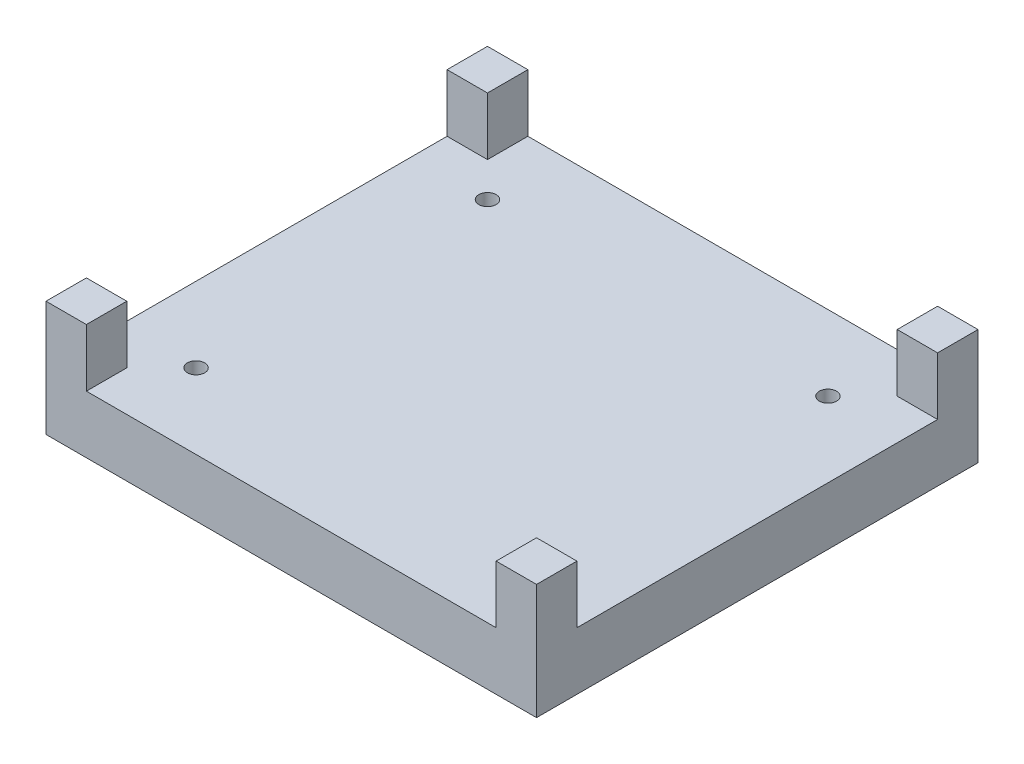
ISO-10303-21;
HEADER;
FILE_DESCRIPTION(('STEP AP214'),'2;1');
FILE_NAME('part.step','',(''),(''),'','','');
FILE_SCHEMA(('AUTOMOTIVE_DESIGN { 1 0 10303 214 1 1 1 1 }'));
ENDSEC;
DATA;
#1=APPLICATION_CONTEXT('core data for automotive mechanical design processes');
#2=APPLICATION_PROTOCOL_DEFINITION('international standard','automotive_design',2000,#1);
#3=PRODUCT_CONTEXT('',#1,'mechanical');
#4=PRODUCT('Part','Part','',(#3));
#5=PRODUCT_RELATED_PRODUCT_CATEGORY('part','',(#4));
#6=PRODUCT_DEFINITION_FORMATION('','',#4);
#7=PRODUCT_DEFINITION_CONTEXT('part definition',#1,'design');
#8=PRODUCT_DEFINITION('design','',#6,#7);
#9=PRODUCT_DEFINITION_SHAPE('','',#8);
#10=(LENGTH_UNIT() NAMED_UNIT(*) SI_UNIT(.MILLI.,.METRE.));
#11=(NAMED_UNIT(*) PLANE_ANGLE_UNIT() SI_UNIT($,.RADIAN.));
#12=(NAMED_UNIT(*) SI_UNIT($,.STERADIAN.) SOLID_ANGLE_UNIT());
#13=UNCERTAINTY_MEASURE_WITH_UNIT(LENGTH_MEASURE(1.E-05),#10,'distance_accuracy_value','');
#14=(GEOMETRIC_REPRESENTATION_CONTEXT(3) GLOBAL_UNCERTAINTY_ASSIGNED_CONTEXT((#13)) GLOBAL_UNIT_ASSIGNED_CONTEXT((#10,
#11,#12)) REPRESENTATION_CONTEXT('',''));
#15=CARTESIAN_POINT('',(0.,0.,0.));
#16=DIRECTION('',(0.,0.,1.));
#17=DIRECTION('',(1.,0.,0.));
#18=AXIS2_PLACEMENT_3D('',#15,#16,#17);
#19=CARTESIAN_POINT('',(0.,10.,0.));
#20=DIRECTION('',(0.,1.,0.));
#21=DIRECTION('',(0.,0.,1.));
#22=AXIS2_PLACEMENT_3D('',#19,#20,#21);
#23=PLANE('',#22);
#24=CARTESIAN_POINT('',(29.5,10.,-25.25));
#25=DIRECTION('',(0.,1.,0.));
#26=DIRECTION('',(0.,0.,1.));
#27=AXIS2_PLACEMENT_3D('',#24,#25,#26);
#28=CIRCLE('',#27,1.5);
#29=CARTESIAN_POINT('',(29.5,10.,-23.75));
#30=VERTEX_POINT('',#29);
#31=EDGE_CURVE('E282',#30,#30,#28,.T.);
#32=ORIENTED_EDGE('',*,*,#31,.F.);
#33=EDGE_LOOP('',(#32));
#34=FACE_BOUND('',#33,.T.);
#35=CARTESIAN_POINT('',(-29.5,10.,25.25));
#36=DIRECTION('',(0.,1.,0.));
#37=DIRECTION('',(0.,0.,1.));
#38=AXIS2_PLACEMENT_3D('',#35,#36,#37);
#39=CIRCLE('',#38,1.5);
#40=CARTESIAN_POINT('',(-29.5,10.,26.75));
#41=VERTEX_POINT('',#40);
#42=EDGE_CURVE('E286',#41,#41,#39,.T.);
#43=ORIENTED_EDGE('',*,*,#42,.F.);
#44=EDGE_LOOP('',(#43));
#45=FACE_BOUND('',#44,.T.);
#46=CARTESIAN_POINT('',(-29.5,10.,-25.25));
#47=DIRECTION('',(0.,1.,0.));
#48=DIRECTION('',(0.,0.,1.));
#49=AXIS2_PLACEMENT_3D('',#46,#47,#48);
#50=CIRCLE('',#49,1.5);
#51=CARTESIAN_POINT('',(-29.5,10.,-23.75));
#52=VERTEX_POINT('',#51);
#53=EDGE_CURVE('E302',#52,#52,#50,.T.);
#54=ORIENTED_EDGE('',*,*,#53,.F.);
#55=EDGE_LOOP('',(#54));
#56=FACE_BOUND('',#55,.T.);
#57=CARTESIAN_POINT('',(29.5,10.,25.25));
#58=DIRECTION('',(0.,1.,0.));
#59=DIRECTION('',(0.,0.,1.));
#60=AXIS2_PLACEMENT_3D('',#57,#58,#59);
#61=CIRCLE('',#60,1.5);
#62=CARTESIAN_POINT('',(29.5,10.,26.75));
#63=VERTEX_POINT('',#62);
#64=EDGE_CURVE('E306',#63,#63,#61,.T.);
#65=ORIENTED_EDGE('',*,*,#64,.F.);
#66=EDGE_LOOP('',(#65));
#67=FACE_BOUND('',#66,.T.);
#68=DIRECTION('',(0.,0.,1.));
#69=VECTOR('',#68,1.);
#70=CARTESIAN_POINT('',(35.5,10.,38.25));
#71=LINE('',#70,#69);
#72=CARTESIAN_POINT('',(35.5,10.,31.25));
#73=VERTEX_POINT('',#72);
#74=CARTESIAN_POINT('',(35.5,10.,38.25));
#75=VERTEX_POINT('',#74);
#76=EDGE_CURVE('E57',#73,#75,#71,.T.);
#77=ORIENTED_EDGE('',*,*,#76,.F.);
#78=DIRECTION('',(-1.,0.,0.));
#79=VECTOR('',#78,1.);
#80=CARTESIAN_POINT('',(42.5,10.,31.25));
#81=LINE('',#80,#79);
#82=CARTESIAN_POINT('',(42.5,10.,31.25));
#83=VERTEX_POINT('',#82);
#84=EDGE_CURVE('E549',#83,#73,#81,.T.);
#85=ORIENTED_EDGE('',*,*,#84,.F.);
#86=DIRECTION('',(0.,0.,-1.));
#87=VECTOR('',#86,1.);
#88=CARTESIAN_POINT('',(42.5,10.,0.));
#89=LINE('',#88,#87);
#90=CARTESIAN_POINT('',(42.5,10.,-31.25));
#91=VERTEX_POINT('',#90);
#92=EDGE_CURVE('E179',#83,#91,#89,.T.);
#93=ORIENTED_EDGE('',*,*,#92,.T.);
#94=DIRECTION('',(1.,0.,0.));
#95=VECTOR('',#94,1.);
#96=CARTESIAN_POINT('',(42.5,10.,-31.25));
#97=LINE('',#96,#95);
#98=CARTESIAN_POINT('',(35.5,10.,-31.25));
#99=VERTEX_POINT('',#98);
#100=EDGE_CURVE('E223',#99,#91,#97,.T.);
#101=ORIENTED_EDGE('',*,*,#100,.F.);
#102=DIRECTION('',(0.,0.,1.));
#103=VECTOR('',#102,1.);
#104=CARTESIAN_POINT('',(35.5,10.,-38.25));
#105=LINE('',#104,#103);
#106=CARTESIAN_POINT('',(35.5,10.,-38.25));
#107=VERTEX_POINT('',#106);
#108=EDGE_CURVE('E217',#107,#99,#105,.T.);
#109=ORIENTED_EDGE('',*,*,#108,.F.);
#110=DIRECTION('',(1.,0.,0.));
#111=VECTOR('',#110,1.);
#112=CARTESIAN_POINT('',(0.,10.,-38.25));
#113=LINE('',#112,#111);
#114=CARTESIAN_POINT('',(-35.5,10.,-38.25));
#115=VERTEX_POINT('',#114);
#116=EDGE_CURVE('E295',#115,#107,#113,.T.);
#117=ORIENTED_EDGE('',*,*,#116,.F.);
#118=DIRECTION('',(0.,0.,-1.));
#119=VECTOR('',#118,1.);
#120=CARTESIAN_POINT('',(-35.5,10.,-38.25));
#121=LINE('',#120,#119);
#122=CARTESIAN_POINT('',(-35.5,10.,-31.25));
#123=VERTEX_POINT('',#122);
#124=EDGE_CURVE('E253',#123,#115,#121,.T.);
#125=ORIENTED_EDGE('',*,*,#124,.F.);
#126=DIRECTION('',(1.,0.,0.));
#127=VECTOR('',#126,1.);
#128=CARTESIAN_POINT('',(-42.5,10.,-31.25));
#129=LINE('',#128,#127);
#130=CARTESIAN_POINT('',(-42.5,10.,-31.25));
#131=VERTEX_POINT('',#130);
#132=EDGE_CURVE('E247',#131,#123,#129,.T.);
#133=ORIENTED_EDGE('',*,*,#132,.F.);
#134=DIRECTION('',(0.,0.,-1.));
#135=VECTOR('',#134,1.);
#136=CARTESIAN_POINT('',(-42.5,10.,0.));
#137=LINE('',#136,#135);
#138=CARTESIAN_POINT('',(-42.5,10.,31.25));
#139=VERTEX_POINT('',#138);
#140=EDGE_CURVE('E299',#139,#131,#137,.T.);
#141=ORIENTED_EDGE('',*,*,#140,.F.);
#142=DIRECTION('',(-1.,0.,0.));
#143=VECTOR('',#142,1.);
#144=CARTESIAN_POINT('',(-42.5,10.,31.25));
#145=LINE('',#144,#143);
#146=CARTESIAN_POINT('',(-35.5,10.,31.25));
#147=VERTEX_POINT('',#146);
#148=EDGE_CURVE('E185',#147,#139,#145,.T.);
#149=ORIENTED_EDGE('',*,*,#148,.F.);
#150=DIRECTION('',(0.,0.,-1.));
#151=VECTOR('',#150,1.);
#152=CARTESIAN_POINT('',(-35.5,10.,38.25));
#153=LINE('',#152,#151);
#154=CARTESIAN_POINT('',(-35.5,10.,38.25));
#155=VERTEX_POINT('',#154);
#156=EDGE_CURVE('E181',#155,#147,#153,.T.);
#157=ORIENTED_EDGE('',*,*,#156,.F.);
#158=DIRECTION('',(1.,0.,0.));
#159=VECTOR('',#158,1.);
#160=CARTESIAN_POINT('',(0.,10.,38.25));
#161=LINE('',#160,#159);
#162=EDGE_CURVE('E62',#155,#75,#161,.T.);
#163=ORIENTED_EDGE('',*,*,#162,.T.);
#164=EDGE_LOOP('',(#77,#85,#93,#101,#109,#117,#125,#133,#141,#149,#157,#163));
#165=FACE_BOUND('',#164,.T.);
#166=ADVANCED_FACE('F41',(#34,#45,#56,#67,#165),#23,.T.);
#167=CARTESIAN_POINT('',(0.,10.,38.25));
#168=DIRECTION('',(0.,0.,-1.));
#169=DIRECTION('',(-1.,0.,0.));
#170=AXIS2_PLACEMENT_3D('',#167,#168,#169);
#171=PLANE('',#170);
#172=DIRECTION('',(1.,0.,0.));
#173=VECTOR('',#172,1.);
#174=CARTESIAN_POINT('',(0.,0.,38.25));
#175=LINE('',#174,#173);
#176=CARTESIAN_POINT('',(-42.5,0.,38.25));
#177=VERTEX_POINT('',#176);
#178=CARTESIAN_POINT('',(42.5,0.,38.25));
#179=VERTEX_POINT('',#178);
#180=EDGE_CURVE('E318',#177,#179,#175,.T.);
#181=ORIENTED_EDGE('',*,*,#180,.T.);
#182=DIRECTION('',(0.,-1.,0.));
#183=VECTOR('',#182,1.);
#184=CARTESIAN_POINT('',(42.5,10.,38.25));
#185=LINE('',#184,#183);
#186=CARTESIAN_POINT('',(42.5,20.,38.25));
#187=VERTEX_POINT('',#186);
#188=EDGE_CURVE('E11',#187,#179,#185,.T.);
#189=ORIENTED_EDGE('',*,*,#188,.F.);
#190=DIRECTION('',(1.,0.,0.));
#191=VECTOR('',#190,1.);
#192=CARTESIAN_POINT('',(42.5,20.,38.25));
#193=LINE('',#192,#191);
#194=CARTESIAN_POINT('',(35.5,20.,38.25));
#195=VERTEX_POINT('',#194);
#196=EDGE_CURVE('E172',#195,#187,#193,.T.);
#197=ORIENTED_EDGE('',*,*,#196,.F.);
#198=DIRECTION('',(0.,-1.,0.));
#199=VECTOR('',#198,1.);
#200=CARTESIAN_POINT('',(35.5,20.,38.25));
#201=LINE('',#200,#199);
#202=EDGE_CURVE('E187',#195,#75,#201,.T.);
#203=ORIENTED_EDGE('',*,*,#202,.T.);
#204=ORIENTED_EDGE('',*,*,#162,.F.);
#205=DIRECTION('',(0.,-1.,0.));
#206=VECTOR('',#205,1.);
#207=CARTESIAN_POINT('',(-35.5,20.,38.25));
#208=LINE('',#207,#206);
#209=CARTESIAN_POINT('',(-35.5,20.,38.25));
#210=VERTEX_POINT('',#209);
#211=EDGE_CURVE('E214',#210,#155,#208,.T.);
#212=ORIENTED_EDGE('',*,*,#211,.F.);
#213=DIRECTION('',(1.,0.,0.));
#214=VECTOR('',#213,1.);
#215=CARTESIAN_POINT('',(-42.5,20.,38.25));
#216=LINE('',#215,#214);
#217=CARTESIAN_POINT('',(-42.5,20.,38.25));
#218=VERTEX_POINT('',#217);
#219=EDGE_CURVE('E195',#218,#210,#216,.T.);
#220=ORIENTED_EDGE('',*,*,#219,.F.);
#221=DIRECTION('',(0.,-1.,0.));
#222=VECTOR('',#221,1.);
#223=CARTESIAN_POINT('',(-42.5,10.,38.25));
#224=LINE('',#223,#222);
#225=EDGE_CURVE('E310',#218,#177,#224,.T.);
#226=ORIENTED_EDGE('',*,*,#225,.T.);
#227=EDGE_LOOP('',(#181,#189,#197,#203,#204,#212,#220,#226));
#228=FACE_BOUND('',#227,.T.);
#229=ADVANCED_FACE('F393',(#228),#171,.F.);
#230=CARTESIAN_POINT('',(42.5,10.,0.));
#231=DIRECTION('',(-1.,0.,0.));
#232=DIRECTION('',(0.,0.,1.));
#233=AXIS2_PLACEMENT_3D('',#230,#231,#232);
#234=PLANE('',#233);
#235=DIRECTION('',(0.,0.,-1.));
#236=VECTOR('',#235,1.);
#237=CARTESIAN_POINT('',(42.5,0.,0.));
#238=LINE('',#237,#236);
#239=CARTESIAN_POINT('',(42.5,0.,-38.25));
#240=VERTEX_POINT('',#239);
#241=EDGE_CURVE('E322',#179,#240,#238,.T.);
#242=ORIENTED_EDGE('',*,*,#241,.T.);
#243=DIRECTION('',(0.,-1.,0.));
#244=VECTOR('',#243,1.);
#245=CARTESIAN_POINT('',(42.5,10.,-38.25));
#246=LINE('',#245,#244);
#247=CARTESIAN_POINT('',(42.5,20.,-38.25));
#248=VERTEX_POINT('',#247);
#249=EDGE_CURVE('E50',#248,#240,#246,.T.);
#250=ORIENTED_EDGE('',*,*,#249,.F.);
#251=DIRECTION('',(0.,0.,-1.));
#252=VECTOR('',#251,1.);
#253=CARTESIAN_POINT('',(42.5,20.,-38.25));
#254=LINE('',#253,#252);
#255=CARTESIAN_POINT('',(42.5,20.,-31.25));
#256=VERTEX_POINT('',#255);
#257=EDGE_CURVE('E218',#256,#248,#254,.T.);
#258=ORIENTED_EDGE('',*,*,#257,.F.);
#259=DIRECTION('',(0.,-1.,0.));
#260=VECTOR('',#259,1.);
#261=CARTESIAN_POINT('',(42.5,20.,-31.25));
#262=LINE('',#261,#260);
#263=EDGE_CURVE('E232',#256,#91,#262,.T.);
#264=ORIENTED_EDGE('',*,*,#263,.T.);
#265=ORIENTED_EDGE('',*,*,#92,.F.);
#266=DIRECTION('',(0.,-1.,0.));
#267=VECTOR('',#266,1.);
#268=CARTESIAN_POINT('',(42.5,20.,31.25));
#269=LINE('',#268,#267);
#270=CARTESIAN_POINT('',(42.5,20.,31.25));
#271=VERTEX_POINT('',#270);
#272=EDGE_CURVE('E159',#271,#83,#269,.T.);
#273=ORIENTED_EDGE('',*,*,#272,.F.);
#274=DIRECTION('',(0.,0.,-1.));
#275=VECTOR('',#274,1.);
#276=CARTESIAN_POINT('',(42.5,20.,38.25));
#277=LINE('',#276,#275);
#278=EDGE_CURVE('E166',#187,#271,#277,.T.);
#279=ORIENTED_EDGE('',*,*,#278,.F.);
#280=ORIENTED_EDGE('',*,*,#188,.T.);
#281=EDGE_LOOP('',(#242,#250,#258,#264,#265,#273,#279,#280));
#282=FACE_BOUND('',#281,.T.);
#283=ADVANCED_FACE('F177',(#282),#234,.F.);
#284=CARTESIAN_POINT('',(0.,10.,-38.25));
#285=DIRECTION('',(0.,0.,-1.));
#286=DIRECTION('',(-1.,0.,0.));
#287=AXIS2_PLACEMENT_3D('',#284,#285,#286);
#288=PLANE('',#287);
#289=DIRECTION('',(1.,0.,0.));
#290=VECTOR('',#289,1.);
#291=CARTESIAN_POINT('',(0.,0.,-38.25));
#292=LINE('',#291,#290);
#293=CARTESIAN_POINT('',(-42.5,0.,-38.25));
#294=VERTEX_POINT('',#293);
#295=EDGE_CURVE('E325',#294,#240,#292,.T.);
#296=ORIENTED_EDGE('',*,*,#295,.F.);
#297=DIRECTION('',(0.,-1.,0.));
#298=VECTOR('',#297,1.);
#299=CARTESIAN_POINT('',(-42.5,10.,-38.25));
#300=LINE('',#299,#298);
#301=CARTESIAN_POINT('',(-42.5,20.,-38.25));
#302=VERTEX_POINT('',#301);
#303=EDGE_CURVE('E342',#302,#294,#300,.T.);
#304=ORIENTED_EDGE('',*,*,#303,.F.);
#305=DIRECTION('',(-1.,0.,0.));
#306=VECTOR('',#305,1.);
#307=CARTESIAN_POINT('',(-42.5,20.,-38.25));
#308=LINE('',#307,#306);
#309=CARTESIAN_POINT('',(-35.5,20.,-38.25));
#310=VERTEX_POINT('',#309);
#311=EDGE_CURVE('E259',#310,#302,#308,.T.);
#312=ORIENTED_EDGE('',*,*,#311,.F.);
#313=DIRECTION('',(0.,-1.,0.));
#314=VECTOR('',#313,1.);
#315=CARTESIAN_POINT('',(-35.5,20.,-38.25));
#316=LINE('',#315,#314);
#317=EDGE_CURVE('E263',#310,#115,#316,.T.);
#318=ORIENTED_EDGE('',*,*,#317,.T.);
#319=ORIENTED_EDGE('',*,*,#116,.T.);
#320=DIRECTION('',(0.,-1.,0.));
#321=VECTOR('',#320,1.);
#322=CARTESIAN_POINT('',(35.5,20.,-38.25));
#323=LINE('',#322,#321);
#324=CARTESIAN_POINT('',(35.5,20.,-38.25));
#325=VERTEX_POINT('',#324);
#326=EDGE_CURVE('E244',#325,#107,#323,.T.);
#327=ORIENTED_EDGE('',*,*,#326,.F.);
#328=DIRECTION('',(-1.,0.,0.));
#329=VECTOR('',#328,1.);
#330=CARTESIAN_POINT('',(42.5,20.,-38.25));
#331=LINE('',#330,#329);
#332=EDGE_CURVE('E222',#248,#325,#331,.T.);
#333=ORIENTED_EDGE('',*,*,#332,.F.);
#334=ORIENTED_EDGE('',*,*,#249,.T.);
#335=EDGE_LOOP('',(#296,#304,#312,#318,#319,#327,#333,#334));
#336=FACE_BOUND('',#335,.T.);
#337=ADVANCED_FACE('F348',(#336),#288,.T.);
#338=CARTESIAN_POINT('',(-29.5,10.,-25.25));
#339=DIRECTION('',(0.,-1.,0.));
#340=DIRECTION('',(0.,0.,-1.));
#341=AXIS2_PLACEMENT_3D('',#338,#339,#340);
#342=CYLINDRICAL_SURFACE('',#341,1.5);
#343=ORIENTED_EDGE('',*,*,#53,.T.);
#344=EDGE_LOOP('',(#343));
#345=FACE_BOUND('',#344,.T.);
#346=CARTESIAN_POINT('',(-29.5,0.,-25.25));
#347=DIRECTION('',(0.,1.,0.));
#348=DIRECTION('',(0.,0.,1.));
#349=AXIS2_PLACEMENT_3D('',#346,#347,#348);
#350=CIRCLE('',#349,1.5);
#351=CARTESIAN_POINT('',(-29.5,0.,-23.75));
#352=VERTEX_POINT('',#351);
#353=EDGE_CURVE('E333',#352,#352,#350,.T.);
#354=ORIENTED_EDGE('',*,*,#353,.F.);
#355=EDGE_LOOP('',(#354));
#356=FACE_BOUND('',#355,.T.);
#357=ADVANCED_FACE('F414',(#345,#356),#342,.F.);
#358=CARTESIAN_POINT('',(-42.5,10.,0.));
#359=DIRECTION('',(-1.,0.,0.));
#360=DIRECTION('',(0.,0.,1.));
#361=AXIS2_PLACEMENT_3D('',#358,#359,#360);
#362=PLANE('',#361);
#363=DIRECTION('',(0.,0.,-1.));
#364=VECTOR('',#363,1.);
#365=CARTESIAN_POINT('',(-42.5,0.,0.));
#366=LINE('',#365,#364);
#367=EDGE_CURVE('E329',#177,#294,#366,.T.);
#368=ORIENTED_EDGE('',*,*,#367,.F.);
#369=ORIENTED_EDGE('',*,*,#225,.F.);
#370=DIRECTION('',(0.,0.,1.));
#371=VECTOR('',#370,1.);
#372=CARTESIAN_POINT('',(-42.5,20.,38.25));
#373=LINE('',#372,#371);
#374=CARTESIAN_POINT('',(-42.5,20.,31.25));
#375=VERTEX_POINT('',#374);
#376=EDGE_CURVE('E191',#375,#218,#373,.T.);
#377=ORIENTED_EDGE('',*,*,#376,.F.);
#378=DIRECTION('',(0.,-1.,0.));
#379=VECTOR('',#378,1.);
#380=CARTESIAN_POINT('',(-42.5,20.,31.25));
#381=LINE('',#380,#379);
#382=EDGE_CURVE('E203',#375,#139,#381,.T.);
#383=ORIENTED_EDGE('',*,*,#382,.T.);
#384=ORIENTED_EDGE('',*,*,#140,.T.);
#385=DIRECTION('',(0.,-1.,0.));
#386=VECTOR('',#385,1.);
#387=CARTESIAN_POINT('',(-42.5,20.,-31.25));
#388=LINE('',#387,#386);
#389=CARTESIAN_POINT('',(-42.5,20.,-31.25));
#390=VERTEX_POINT('',#389);
#391=EDGE_CURVE('E277',#390,#131,#388,.T.);
#392=ORIENTED_EDGE('',*,*,#391,.F.);
#393=DIRECTION('',(0.,0.,1.));
#394=VECTOR('',#393,1.);
#395=CARTESIAN_POINT('',(-42.5,20.,-38.25));
#396=LINE('',#395,#394);
#397=EDGE_CURVE('E248',#302,#390,#396,.T.);
#398=ORIENTED_EDGE('',*,*,#397,.F.);
#399=ORIENTED_EDGE('',*,*,#303,.T.);
#400=EDGE_LOOP('',(#368,#369,#377,#383,#384,#392,#398,#399));
#401=FACE_BOUND('',#400,.T.);
#402=ADVANCED_FACE('F357',(#401),#362,.T.);
#403=CARTESIAN_POINT('',(-29.5,10.,25.25));
#404=DIRECTION('',(0.,-1.,0.));
#405=DIRECTION('',(0.,0.,-1.));
#406=AXIS2_PLACEMENT_3D('',#403,#404,#405);
#407=CYLINDRICAL_SURFACE('',#406,1.5);
#408=ORIENTED_EDGE('',*,*,#42,.T.);
#409=EDGE_LOOP('',(#408));
#410=FACE_BOUND('',#409,.T.);
#411=CARTESIAN_POINT('',(-29.5,0.,25.25));
#412=DIRECTION('',(0.,1.,0.));
#413=DIRECTION('',(0.,0.,1.));
#414=AXIS2_PLACEMENT_3D('',#411,#412,#413);
#415=CIRCLE('',#414,1.5);
#416=CARTESIAN_POINT('',(-29.5,0.,26.75));
#417=VERTEX_POINT('',#416);
#418=EDGE_CURVE('E314',#417,#417,#415,.T.);
#419=ORIENTED_EDGE('',*,*,#418,.F.);
#420=EDGE_LOOP('',(#419));
#421=FACE_BOUND('',#420,.T.);
#422=ADVANCED_FACE('F420',(#410,#421),#407,.F.);
#423=CARTESIAN_POINT('',(29.5,10.,-25.25));
#424=DIRECTION('',(0.,-1.,0.));
#425=DIRECTION('',(0.,0.,-1.));
#426=AXIS2_PLACEMENT_3D('',#423,#424,#425);
#427=CYLINDRICAL_SURFACE('',#426,1.5);
#428=ORIENTED_EDGE('',*,*,#31,.T.);
#429=EDGE_LOOP('',(#428));
#430=FACE_BOUND('',#429,.T.);
#431=CARTESIAN_POINT('',(29.5,0.,-25.25));
#432=DIRECTION('',(0.,1.,0.));
#433=DIRECTION('',(0.,0.,1.));
#434=AXIS2_PLACEMENT_3D('',#431,#432,#433);
#435=CIRCLE('',#434,1.5);
#436=CARTESIAN_POINT('',(29.5,0.,-23.75));
#437=VERTEX_POINT('',#436);
#438=EDGE_CURVE('E281',#437,#437,#435,.T.);
#439=ORIENTED_EDGE('',*,*,#438,.F.);
#440=EDGE_LOOP('',(#439));
#441=FACE_BOUND('',#440,.T.);
#442=ADVANCED_FACE('F43',(#430,#441),#427,.F.);
#443=CARTESIAN_POINT('',(29.5,10.,25.25));
#444=DIRECTION('',(0.,-1.,0.));
#445=DIRECTION('',(0.,0.,-1.));
#446=AXIS2_PLACEMENT_3D('',#443,#444,#445);
#447=CYLINDRICAL_SURFACE('',#446,1.5);
#448=ORIENTED_EDGE('',*,*,#64,.T.);
#449=EDGE_LOOP('',(#448));
#450=FACE_BOUND('',#449,.T.);
#451=CARTESIAN_POINT('',(29.5,0.,25.25));
#452=DIRECTION('',(0.,1.,0.));
#453=DIRECTION('',(0.,0.,1.));
#454=AXIS2_PLACEMENT_3D('',#451,#452,#453);
#455=CIRCLE('',#454,1.5);
#456=CARTESIAN_POINT('',(29.5,0.,26.75));
#457=VERTEX_POINT('',#456);
#458=EDGE_CURVE('E287',#457,#457,#455,.T.);
#459=ORIENTED_EDGE('',*,*,#458,.F.);
#460=EDGE_LOOP('',(#459));
#461=FACE_BOUND('',#460,.T.);
#462=ADVANCED_FACE('F409',(#450,#461),#447,.F.);
#463=CARTESIAN_POINT('',(0.,0.,0.));
#464=DIRECTION('',(0.,1.,0.));
#465=DIRECTION('',(0.,0.,1.));
#466=AXIS2_PLACEMENT_3D('',#463,#464,#465);
#467=PLANE('',#466);
#468=ORIENTED_EDGE('',*,*,#438,.T.);
#469=EDGE_LOOP('',(#468));
#470=FACE_BOUND('',#469,.T.);
#471=ORIENTED_EDGE('',*,*,#418,.T.);
#472=EDGE_LOOP('',(#471));
#473=FACE_BOUND('',#472,.T.);
#474=ORIENTED_EDGE('',*,*,#180,.F.);
#475=ORIENTED_EDGE('',*,*,#367,.T.);
#476=ORIENTED_EDGE('',*,*,#295,.T.);
#477=ORIENTED_EDGE('',*,*,#241,.F.);
#478=EDGE_LOOP('',(#474,#475,#476,#477));
#479=FACE_BOUND('',#478,.T.);
#480=ORIENTED_EDGE('',*,*,#353,.T.);
#481=EDGE_LOOP('',(#480));
#482=FACE_BOUND('',#481,.T.);
#483=ORIENTED_EDGE('',*,*,#458,.T.);
#484=EDGE_LOOP('',(#483));
#485=FACE_BOUND('',#484,.T.);
#486=ADVANCED_FACE('F353',(#470,#473,#479,#482,#485),#467,.F.);
#487=CARTESIAN_POINT('',(-42.5,20.,-31.25));
#488=DIRECTION('',(0.,0.,-1.));
#489=DIRECTION('',(-1.,0.,0.));
#490=AXIS2_PLACEMENT_3D('',#487,#488,#489);
#491=PLANE('',#490);
#492=ORIENTED_EDGE('',*,*,#132,.T.);
#493=DIRECTION('',(0.,-1.,0.));
#494=VECTOR('',#493,1.);
#495=CARTESIAN_POINT('',(-35.5,20.,-31.25));
#496=LINE('',#495,#494);
#497=CARTESIAN_POINT('',(-35.5,20.,-31.25));
#498=VERTEX_POINT('',#497);
#499=EDGE_CURVE('E273',#498,#123,#496,.T.);
#500=ORIENTED_EDGE('',*,*,#499,.F.);
#501=DIRECTION('',(1.,0.,0.));
#502=VECTOR('',#501,1.);
#503=CARTESIAN_POINT('',(-42.5,20.,-31.25));
#504=LINE('',#503,#502);
#505=EDGE_CURVE('E252',#390,#498,#504,.T.);
#506=ORIENTED_EDGE('',*,*,#505,.F.);
#507=ORIENTED_EDGE('',*,*,#391,.T.);
#508=EDGE_LOOP('',(#492,#500,#506,#507));
#509=FACE_BOUND('',#508,.T.);
#510=ADVANCED_FACE('F405',(#509),#491,.F.);
#511=CARTESIAN_POINT('',(-35.5,20.,-38.25));
#512=DIRECTION('',(-1.,0.,0.));
#513=DIRECTION('',(0.,0.,1.));
#514=AXIS2_PLACEMENT_3D('',#511,#512,#513);
#515=PLANE('',#514);
#516=ORIENTED_EDGE('',*,*,#124,.T.);
#517=ORIENTED_EDGE('',*,*,#317,.F.);
#518=DIRECTION('',(0.,0.,-1.));
#519=VECTOR('',#518,1.);
#520=CARTESIAN_POINT('',(-35.5,20.,-38.25));
#521=LINE('',#520,#519);
#522=EDGE_CURVE('E256',#498,#310,#521,.T.);
#523=ORIENTED_EDGE('',*,*,#522,.F.);
#524=ORIENTED_EDGE('',*,*,#499,.T.);
#525=EDGE_LOOP('',(#516,#517,#523,#524));
#526=FACE_BOUND('',#525,.T.);
#527=ADVANCED_FACE('F369',(#526),#515,.F.);
#528=CARTESIAN_POINT('',(0.,20.,0.));
#529=DIRECTION('',(0.,1.,0.));
#530=DIRECTION('',(0.,0.,1.));
#531=AXIS2_PLACEMENT_3D('',#528,#529,#530);
#532=PLANE('',#531);
#533=ORIENTED_EDGE('',*,*,#397,.T.);
#534=ORIENTED_EDGE('',*,*,#505,.T.);
#535=ORIENTED_EDGE('',*,*,#522,.T.);
#536=ORIENTED_EDGE('',*,*,#311,.T.);
#537=EDGE_LOOP('',(#533,#534,#535,#536));
#538=FACE_BOUND('',#537,.T.);
#539=ADVANCED_FACE('F364',(#538),#532,.T.);
#540=CARTESIAN_POINT('',(35.5,20.,-38.25));
#541=DIRECTION('',(1.,0.,0.));
#542=DIRECTION('',(0.,0.,-1.));
#543=AXIS2_PLACEMENT_3D('',#540,#541,#542);
#544=PLANE('',#543);
#545=ORIENTED_EDGE('',*,*,#108,.T.);
#546=DIRECTION('',(0.,-1.,0.));
#547=VECTOR('',#546,1.);
#548=CARTESIAN_POINT('',(35.5,20.,-31.25));
#549=LINE('',#548,#547);
#550=CARTESIAN_POINT('',(35.5,20.,-31.25));
#551=VERTEX_POINT('',#550);
#552=EDGE_CURVE('E241',#551,#99,#549,.T.);
#553=ORIENTED_EDGE('',*,*,#552,.F.);
#554=DIRECTION('',(0.,0.,1.));
#555=VECTOR('',#554,1.);
#556=CARTESIAN_POINT('',(35.5,20.,-38.25));
#557=LINE('',#556,#555);
#558=EDGE_CURVE('E226',#325,#551,#557,.T.);
#559=ORIENTED_EDGE('',*,*,#558,.F.);
#560=ORIENTED_EDGE('',*,*,#326,.T.);
#561=EDGE_LOOP('',(#545,#553,#559,#560));
#562=FACE_BOUND('',#561,.T.);
#563=ADVANCED_FACE('F376',(#562),#544,.F.);
#564=CARTESIAN_POINT('',(42.5,20.,-31.25));
#565=DIRECTION('',(0.,0.,-1.));
#566=DIRECTION('',(-1.,0.,0.));
#567=AXIS2_PLACEMENT_3D('',#564,#565,#566);
#568=PLANE('',#567);
#569=ORIENTED_EDGE('',*,*,#100,.T.);
#570=ORIENTED_EDGE('',*,*,#263,.F.);
#571=DIRECTION('',(1.,0.,0.));
#572=VECTOR('',#571,1.);
#573=CARTESIAN_POINT('',(42.5,20.,-31.25));
#574=LINE('',#573,#572);
#575=EDGE_CURVE('E229',#551,#256,#574,.T.);
#576=ORIENTED_EDGE('',*,*,#575,.F.);
#577=ORIENTED_EDGE('',*,*,#552,.T.);
#578=EDGE_LOOP('',(#569,#570,#576,#577));
#579=FACE_BOUND('',#578,.T.);
#580=ADVANCED_FACE('F382',(#579),#568,.F.);
#581=CARTESIAN_POINT('',(0.,20.,0.));
#582=DIRECTION('',(0.,-1.,0.));
#583=DIRECTION('',(0.,0.,-1.));
#584=AXIS2_PLACEMENT_3D('',#581,#582,#583);
#585=PLANE('',#584);
#586=ORIENTED_EDGE('',*,*,#257,.T.);
#587=ORIENTED_EDGE('',*,*,#332,.T.);
#588=ORIENTED_EDGE('',*,*,#558,.T.);
#589=ORIENTED_EDGE('',*,*,#575,.T.);
#590=EDGE_LOOP('',(#586,#587,#588,#589));
#591=FACE_BOUND('',#590,.T.);
#592=ADVANCED_FACE('F379',(#591),#585,.F.);
#593=CARTESIAN_POINT('',(-35.5,20.,38.25));
#594=DIRECTION('',(-1.,0.,0.));
#595=DIRECTION('',(0.,0.,1.));
#596=AXIS2_PLACEMENT_3D('',#593,#594,#595);
#597=PLANE('',#596);
#598=ORIENTED_EDGE('',*,*,#156,.T.);
#599=DIRECTION('',(0.,-1.,0.));
#600=VECTOR('',#599,1.);
#601=CARTESIAN_POINT('',(-35.5,20.,31.25));
#602=LINE('',#601,#600);
#603=CARTESIAN_POINT('',(-35.5,20.,31.25));
#604=VERTEX_POINT('',#603);
#605=EDGE_CURVE('E210',#604,#147,#602,.T.);
#606=ORIENTED_EDGE('',*,*,#605,.F.);
#607=DIRECTION('',(0.,0.,-1.));
#608=VECTOR('',#607,1.);
#609=CARTESIAN_POINT('',(-35.5,20.,38.25));
#610=LINE('',#609,#608);
#611=EDGE_CURVE('E198',#210,#604,#610,.T.);
#612=ORIENTED_EDGE('',*,*,#611,.F.);
#613=ORIENTED_EDGE('',*,*,#211,.T.);
#614=EDGE_LOOP('',(#598,#606,#612,#613));
#615=FACE_BOUND('',#614,.T.);
#616=ADVANCED_FACE('F389',(#615),#597,.F.);
#617=CARTESIAN_POINT('',(-42.5,20.,31.25));
#618=DIRECTION('',(0.,0.,1.));
#619=DIRECTION('',(1.,0.,0.));
#620=AXIS2_PLACEMENT_3D('',#617,#618,#619);
#621=PLANE('',#620);
#622=ORIENTED_EDGE('',*,*,#148,.T.);
#623=ORIENTED_EDGE('',*,*,#382,.F.);
#624=DIRECTION('',(-1.,0.,0.));
#625=VECTOR('',#624,1.);
#626=CARTESIAN_POINT('',(-42.5,20.,31.25));
#627=LINE('',#626,#625);
#628=EDGE_CURVE('E201',#604,#375,#627,.T.);
#629=ORIENTED_EDGE('',*,*,#628,.F.);
#630=ORIENTED_EDGE('',*,*,#605,.T.);
#631=EDGE_LOOP('',(#622,#623,#629,#630));
#632=FACE_BOUND('',#631,.T.);
#633=ADVANCED_FACE('F496',(#632),#621,.F.);
#634=CARTESIAN_POINT('',(0.,20.,0.));
#635=DIRECTION('',(0.,-1.,0.));
#636=DIRECTION('',(0.,0.,-1.));
#637=AXIS2_PLACEMENT_3D('',#634,#635,#636);
#638=PLANE('',#637);
#639=ORIENTED_EDGE('',*,*,#376,.T.);
#640=ORIENTED_EDGE('',*,*,#219,.T.);
#641=ORIENTED_EDGE('',*,*,#611,.T.);
#642=ORIENTED_EDGE('',*,*,#628,.T.);
#643=EDGE_LOOP('',(#639,#640,#641,#642));
#644=FACE_BOUND('',#643,.T.);
#645=ADVANCED_FACE('F506',(#644),#638,.F.);
#646=CARTESIAN_POINT('',(42.5,20.,31.25));
#647=DIRECTION('',(0.,0.,1.));
#648=DIRECTION('',(1.,0.,0.));
#649=AXIS2_PLACEMENT_3D('',#646,#647,#648);
#650=PLANE('',#649);
#651=ORIENTED_EDGE('',*,*,#84,.T.);
#652=DIRECTION('',(0.,-1.,0.));
#653=VECTOR('',#652,1.);
#654=CARTESIAN_POINT('',(35.5,20.,31.25));
#655=LINE('',#654,#653);
#656=CARTESIAN_POINT('',(35.5,20.,31.25));
#657=VERTEX_POINT('',#656);
#658=EDGE_CURVE('E161',#657,#73,#655,.T.);
#659=ORIENTED_EDGE('',*,*,#658,.F.);
#660=DIRECTION('',(-1.,0.,0.));
#661=VECTOR('',#660,1.);
#662=CARTESIAN_POINT('',(42.5,20.,31.25));
#663=LINE('',#662,#661);
#664=EDGE_CURVE('E155',#271,#657,#663,.T.);
#665=ORIENTED_EDGE('',*,*,#664,.F.);
#666=ORIENTED_EDGE('',*,*,#272,.T.);
#667=EDGE_LOOP('',(#651,#659,#665,#666));
#668=FACE_BOUND('',#667,.T.);
#669=ADVANCED_FACE('F157',(#668),#650,.F.);
#670=CARTESIAN_POINT('',(35.5,20.,38.25));
#671=DIRECTION('',(1.,0.,0.));
#672=DIRECTION('',(0.,0.,-1.));
#673=AXIS2_PLACEMENT_3D('',#670,#671,#672);
#674=PLANE('',#673);
#675=ORIENTED_EDGE('',*,*,#76,.T.);
#676=ORIENTED_EDGE('',*,*,#202,.F.);
#677=DIRECTION('',(0.,0.,1.));
#678=VECTOR('',#677,1.);
#679=CARTESIAN_POINT('',(35.5,20.,38.25));
#680=LINE('',#679,#678);
#681=EDGE_CURVE('E165',#657,#195,#680,.T.);
#682=ORIENTED_EDGE('',*,*,#681,.F.);
#683=ORIENTED_EDGE('',*,*,#658,.T.);
#684=EDGE_LOOP('',(#675,#676,#682,#683));
#685=FACE_BOUND('',#684,.T.);
#686=ADVANCED_FACE('F525',(#685),#674,.F.);
#687=CARTESIAN_POINT('',(0.,20.,0.));
#688=DIRECTION('',(0.,1.,0.));
#689=DIRECTION('',(0.,0.,1.));
#690=AXIS2_PLACEMENT_3D('',#687,#688,#689);
#691=PLANE('',#690);
#692=ORIENTED_EDGE('',*,*,#278,.T.);
#693=ORIENTED_EDGE('',*,*,#664,.T.);
#694=ORIENTED_EDGE('',*,*,#681,.T.);
#695=ORIENTED_EDGE('',*,*,#196,.T.);
#696=EDGE_LOOP('',(#692,#693,#694,#695));
#697=FACE_BOUND('',#696,.T.);
#698=ADVANCED_FACE('F170',(#697),#691,.T.);
#699=CLOSED_SHELL('',(#166,#229,#283,#337,#357,#402,#422,#442,#462,#486,#510,#527,#539,#563,
#580,#592,#616,#633,#645,#669,#686,#698));
#700=MANIFOLD_SOLID_BREP('B2',#699);
#701=ADVANCED_BREP_SHAPE_REPRESENTATION('',(#18,#700),#14);
#702=SHAPE_DEFINITION_REPRESENTATION(#9,#701);
ENDSEC;
END-ISO-10303-21;
